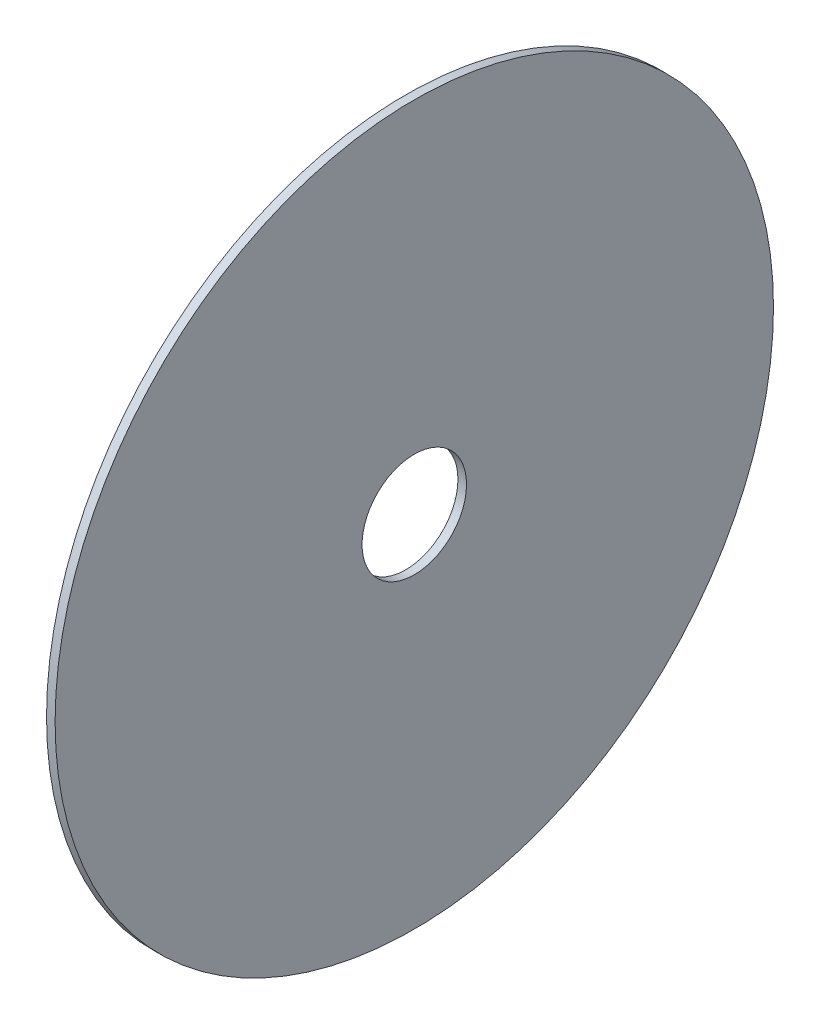
ISO-10303-21;
HEADER;
FILE_DESCRIPTION(('STEP AP214'),'2;1');
FILE_NAME('part.step','',(''),(''),'','','');
FILE_SCHEMA(('AUTOMOTIVE_DESIGN { 1 0 10303 214 1 1 1 1 }'));
ENDSEC;
DATA;
#1=APPLICATION_CONTEXT('core data for automotive mechanical design processes');
#2=APPLICATION_PROTOCOL_DEFINITION('international standard','automotive_design',2000,#1);
#3=PRODUCT_CONTEXT('',#1,'mechanical');
#4=PRODUCT('Part','Part','',(#3));
#5=PRODUCT_RELATED_PRODUCT_CATEGORY('part','',(#4));
#6=PRODUCT_DEFINITION_FORMATION('','',#4);
#7=PRODUCT_DEFINITION_CONTEXT('part definition',#1,'design');
#8=PRODUCT_DEFINITION('design','',#6,#7);
#9=PRODUCT_DEFINITION_SHAPE('','',#8);
#10=(LENGTH_UNIT() NAMED_UNIT(*) SI_UNIT(.MILLI.,.METRE.));
#11=(NAMED_UNIT(*) PLANE_ANGLE_UNIT() SI_UNIT($,.RADIAN.));
#12=(NAMED_UNIT(*) SI_UNIT($,.STERADIAN.) SOLID_ANGLE_UNIT());
#13=UNCERTAINTY_MEASURE_WITH_UNIT(LENGTH_MEASURE(1.E-05),#10,'distance_accuracy_value','');
#14=(GEOMETRIC_REPRESENTATION_CONTEXT(3) GLOBAL_UNCERTAINTY_ASSIGNED_CONTEXT((#13)) GLOBAL_UNIT_ASSIGNED_CONTEXT((#10,
#11,#12)) REPRESENTATION_CONTEXT('',''));
#15=CARTESIAN_POINT('',(0.,0.,0.));
#16=DIRECTION('',(0.,0.,1.));
#17=DIRECTION('',(1.,0.,0.));
#18=AXIS2_PLACEMENT_3D('',#15,#16,#17);
#19=CARTESIAN_POINT('',(6.00000000000001,0.,0.));
#20=DIRECTION('',(-1.,0.,0.));
#21=DIRECTION('',(0.,0.,1.));
#22=AXIS2_PLACEMENT_3D('',#19,#20,#21);
#23=CYLINDRICAL_SURFACE('',#22,251.);
#24=CARTESIAN_POINT('',(6.00000000000001,0.,0.));
#25=DIRECTION('',(1.,0.,0.));
#26=DIRECTION('',(0.,0.,-1.));
#27=AXIS2_PLACEMENT_3D('',#24,#25,#26);
#28=CIRCLE('',#27,251.);
#29=CARTESIAN_POINT('',(6.00000000000001,0.,-251.));
#30=VERTEX_POINT('',#29);
#31=EDGE_CURVE('E12',#30,#30,#28,.T.);
#32=ORIENTED_EDGE('',*,*,#31,.F.);
#33=EDGE_LOOP('',(#32));
#34=FACE_BOUND('',#33,.T.);
#35=CARTESIAN_POINT('',(0.,0.,0.));
#36=DIRECTION('',(1.,0.,0.));
#37=DIRECTION('',(0.,0.,-1.));
#38=AXIS2_PLACEMENT_3D('',#35,#36,#37);
#39=CIRCLE('',#38,251.);
#40=CARTESIAN_POINT('',(0.,0.,-251.));
#41=VERTEX_POINT('',#40);
#42=EDGE_CURVE('E52',#41,#41,#39,.T.);
#43=ORIENTED_EDGE('',*,*,#42,.T.);
#44=EDGE_LOOP('',(#43));
#45=FACE_BOUND('',#44,.T.);
#46=ADVANCED_FACE('F49',(#34,#45),#23,.T.);
#47=CARTESIAN_POINT('',(6.00000000000001,0.,0.));
#48=DIRECTION('',(1.,0.,0.));
#49=DIRECTION('',(0.,0.,-1.));
#50=AXIS2_PLACEMENT_3D('',#47,#48,#49);
#51=PLANE('',#50);
#52=CARTESIAN_POINT('',(6.00000000000001,0.,0.));
#53=DIRECTION('',(1.,0.,0.));
#54=DIRECTION('',(0.,0.,-1.));
#55=AXIS2_PLACEMENT_3D('',#52,#53,#54);
#56=CIRCLE('',#55,36.5);
#57=CARTESIAN_POINT('',(6.00000000000001,0.,-36.5));
#58=VERTEX_POINT('',#57);
#59=EDGE_CURVE('E61',#58,#58,#56,.T.);
#60=ORIENTED_EDGE('',*,*,#59,.F.);
#61=EDGE_LOOP('',(#60));
#62=FACE_BOUND('',#61,.T.);
#63=ORIENTED_EDGE('',*,*,#31,.T.);
#64=EDGE_LOOP('',(#63));
#65=FACE_BOUND('',#64,.T.);
#66=ADVANCED_FACE('F76',(#62,#65),#51,.T.);
#67=CARTESIAN_POINT('',(0.,0.,0.));
#68=DIRECTION('',(1.,0.,0.));
#69=DIRECTION('',(0.,0.,-1.));
#70=AXIS2_PLACEMENT_3D('',#67,#68,#69);
#71=PLANE('',#70);
#72=CARTESIAN_POINT('',(0.,0.,0.));
#73=DIRECTION('',(1.,0.,0.));
#74=DIRECTION('',(0.,0.,-1.));
#75=AXIS2_PLACEMENT_3D('',#72,#73,#74);
#76=CIRCLE('',#75,36.5);
#77=CARTESIAN_POINT('',(0.,0.,-36.5));
#78=VERTEX_POINT('',#77);
#79=EDGE_CURVE('E59',#78,#78,#76,.T.);
#80=ORIENTED_EDGE('',*,*,#79,.T.);
#81=EDGE_LOOP('',(#80));
#82=FACE_BOUND('',#81,.T.);
#83=ORIENTED_EDGE('',*,*,#42,.F.);
#84=EDGE_LOOP('',(#83));
#85=FACE_BOUND('',#84,.T.);
#86=ADVANCED_FACE('F67',(#82,#85),#71,.F.);
#87=CARTESIAN_POINT('',(0.,0.,0.));
#88=DIRECTION('',(1.,0.,0.));
#89=DIRECTION('',(0.,0.,-1.));
#90=AXIS2_PLACEMENT_3D('',#87,#88,#89);
#91=CYLINDRICAL_SURFACE('',#90,36.5);
#92=ORIENTED_EDGE('',*,*,#79,.F.);
#93=EDGE_LOOP('',(#92));
#94=FACE_BOUND('',#93,.T.);
#95=ORIENTED_EDGE('',*,*,#59,.T.);
#96=EDGE_LOOP('',(#95));
#97=FACE_BOUND('',#96,.T.);
#98=ADVANCED_FACE('F70',(#94,#97),#91,.F.);
#99=CLOSED_SHELL('',(#46,#66,#86,#98));
#100=MANIFOLD_SOLID_BREP('B2',#99);
#101=ADVANCED_BREP_SHAPE_REPRESENTATION('',(#18,#100),#14);
#102=SHAPE_DEFINITION_REPRESENTATION(#9,#101);
ENDSEC;
END-ISO-10303-21;
